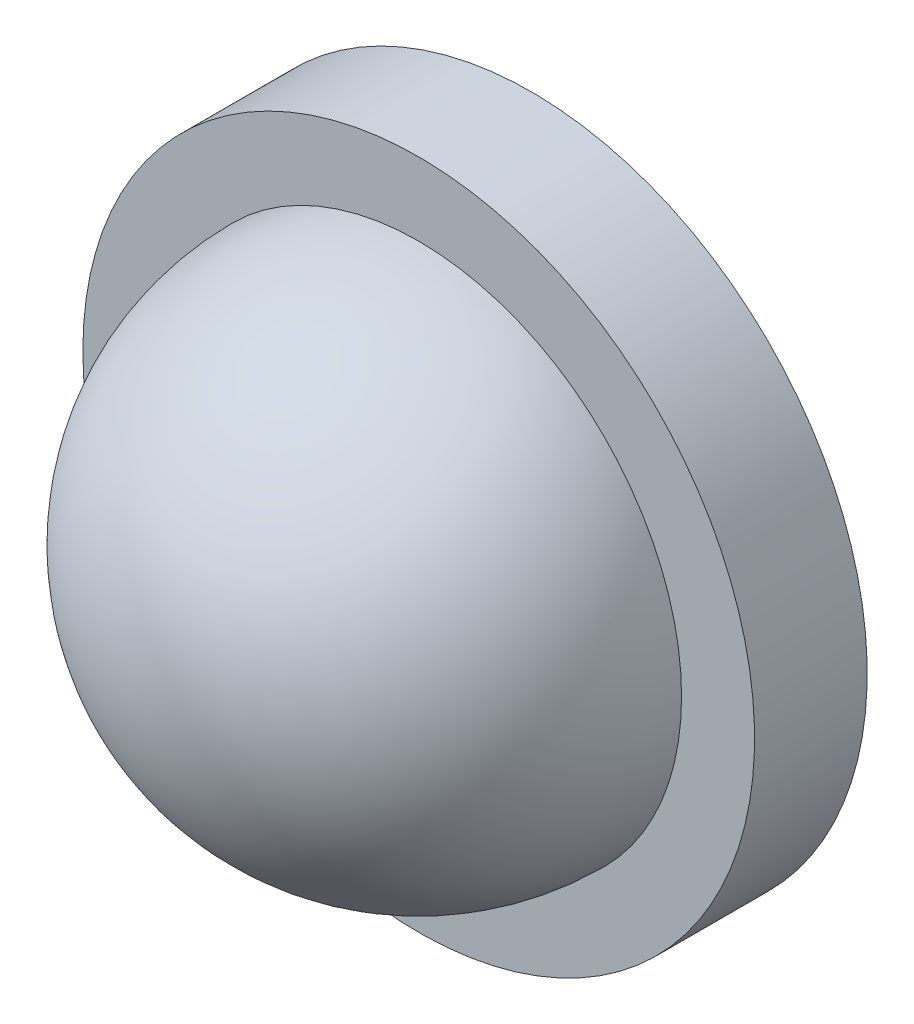
ISO-10303-21;
HEADER;
FILE_DESCRIPTION(('STEP AP214'),'2;1');
FILE_NAME('part.step','',(''),(''),'','','');
FILE_SCHEMA(('AUTOMOTIVE_DESIGN { 1 0 10303 214 1 1 1 1 }'));
ENDSEC;
DATA;
#1=APPLICATION_CONTEXT('core data for automotive mechanical design processes');
#2=APPLICATION_PROTOCOL_DEFINITION('international standard','automotive_design',2000,#1);
#3=PRODUCT_CONTEXT('',#1,'mechanical');
#4=PRODUCT('Part','Part','',(#3));
#5=PRODUCT_RELATED_PRODUCT_CATEGORY('part','',(#4));
#6=PRODUCT_DEFINITION_FORMATION('','',#4);
#7=PRODUCT_DEFINITION_CONTEXT('part definition',#1,'design');
#8=PRODUCT_DEFINITION('design','',#6,#7);
#9=PRODUCT_DEFINITION_SHAPE('','',#8);
#10=(LENGTH_UNIT() NAMED_UNIT(*) SI_UNIT(.MILLI.,.METRE.));
#11=(NAMED_UNIT(*) PLANE_ANGLE_UNIT() SI_UNIT($,.RADIAN.));
#12=(NAMED_UNIT(*) SI_UNIT($,.STERADIAN.) SOLID_ANGLE_UNIT());
#13=UNCERTAINTY_MEASURE_WITH_UNIT(LENGTH_MEASURE(1.E-05),#10,'distance_accuracy_value','');
#14=(GEOMETRIC_REPRESENTATION_CONTEXT(3) GLOBAL_UNCERTAINTY_ASSIGNED_CONTEXT((#13)) GLOBAL_UNIT_ASSIGNED_CONTEXT((#10,
#11,#12)) REPRESENTATION_CONTEXT('',''));
#15=CARTESIAN_POINT('',(0.,0.,0.));
#16=DIRECTION('',(0.,0.,1.));
#17=DIRECTION('',(1.,0.,0.));
#18=AXIS2_PLACEMENT_3D('',#15,#16,#17);
#19=CARTESIAN_POINT('',(0.,0.,0.));
#20=DIRECTION('',(0.,0.,1.));
#21=DIRECTION('',(1.,0.,0.));
#22=AXIS2_PLACEMENT_3D('',#19,#20,#21);
#23=PLANE('',#22);
#24=CARTESIAN_POINT('',(0.,0.,0.));
#25=DIRECTION('',(0.,0.,1.));
#26=DIRECTION('',(1.,0.,0.));
#27=AXIS2_PLACEMENT_3D('',#24,#25,#26);
#28=CIRCLE('',#27,44.7213595499958);
#29=CARTESIAN_POINT('',(-44.7213595499958,0.,0.));
#30=VERTEX_POINT('',#29);
#31=EDGE_CURVE('E9',#30,#30,#28,.T.);
#32=ORIENTED_EDGE('',*,*,#31,.T.);
#33=EDGE_LOOP('',(#32));
#34=FACE_BOUND('',#33,.T.);
#35=CARTESIAN_POINT('',(0.,0.,0.));
#36=DIRECTION('',(0.,0.,1.));
#37=DIRECTION('',(0.,1.,0.));
#38=AXIS2_PLACEMENT_3D('',#35,#36,#37);
#39=CIRCLE('',#38,35.);
#40=CARTESIAN_POINT('',(-35.,0.,0.));
#41=VERTEX_POINT('',#40);
#42=EDGE_CURVE('E52',#41,#41,#39,.T.);
#43=ORIENTED_EDGE('',*,*,#42,.F.);
#44=EDGE_LOOP('',(#43));
#45=FACE_BOUND('',#44,.T.);
#46=ADVANCED_FACE('F14',(#34,#45),#23,.T.);
#47=CARTESIAN_POINT('',(0.,0.,0.));
#48=DIRECTION('',(0.,0.,-1.));
#49=DIRECTION('',(1.,0.,0.));
#50=AXIS2_PLACEMENT_3D('',#47,#48,#49);
#51=CYLINDRICAL_SURFACE('',#50,44.7213595499958);
#52=CARTESIAN_POINT('',(0.,0.,-15.));
#53=DIRECTION('',(0.,0.,-1.));
#54=DIRECTION('',(1.,0.,0.));
#55=AXIS2_PLACEMENT_3D('',#52,#53,#54);
#56=CIRCLE('',#55,44.7213595499958);
#57=CARTESIAN_POINT('',(-44.7213595499958,0.,-15.));
#58=VERTEX_POINT('',#57);
#59=EDGE_CURVE('E43',#58,#58,#56,.T.);
#60=ORIENTED_EDGE('',*,*,#59,.F.);
#61=DIRECTION('',(0.,0.,1.));
#62=VECTOR('',#61,1.);
#63=CARTESIAN_POINT('',(-44.7213595499958,0.,0.));
#64=LINE('',#63,#62);
#65=EDGE_CURVE('E24',#58,#30,#64,.T.);
#66=ORIENTED_EDGE('',*,*,#65,.T.);
#67=ORIENTED_EDGE('',*,*,#31,.F.);
#68=ORIENTED_EDGE('',*,*,#65,.F.);
#69=EDGE_LOOP('',(#60,#66,#67,#68));
#70=FACE_BOUND('',#69,.T.);
#71=ADVANCED_FACE('F16',(#70),#51,.T.);
#72=CARTESIAN_POINT('',(0.,0.,-15.));
#73=DIRECTION('',(0.,0.,1.));
#74=DIRECTION('',(1.,0.,0.));
#75=AXIS2_PLACEMENT_3D('',#72,#73,#74);
#76=PLANE('',#75);
#77=ORIENTED_EDGE('',*,*,#59,.T.);
#78=EDGE_LOOP('',(#77));
#79=FACE_BOUND('',#78,.T.);
#80=ADVANCED_FACE('F65',(#79),#76,.F.);
#81=CARTESIAN_POINT('',(0.,0.,0.));
#82=DIRECTION('',(0.,0.,1.));
#83=DIRECTION('',(1.,0.,0.));
#84=AXIS2_PLACEMENT_3D('',#81,#82,#83);
#85=SPHERICAL_SURFACE('',#84,35.);
#86=ORIENTED_EDGE('',*,*,#42,.T.);
#87=CARTESIAN_POINT('',(0.,0.,0.));
#88=DIRECTION('',(0.,-1.,0.));
#89=DIRECTION('',(-1.,0.,0.));
#90=AXIS2_PLACEMENT_3D('',#87,#88,#89);
#91=CIRCLE('',#90,35.);
#92=CARTESIAN_POINT('',(0.,0.,35.));
#93=VERTEX_POINT('',#92);
#94=EDGE_CURVE('E50',#93,#41,#91,.T.);
#95=ORIENTED_EDGE('',*,*,#94,.F.);
#96=ORIENTED_EDGE('',*,*,#94,.T.);
#97=EDGE_LOOP('',(#86,#95,#96));
#98=FACE_BOUND('',#97,.T.);
#99=ADVANCED_FACE('F51',(#98),#85,.T.);
#100=CLOSED_SHELL('',(#46,#71,#80,#99));
#101=MANIFOLD_SOLID_BREP('B1',#100);
#102=ADVANCED_BREP_SHAPE_REPRESENTATION('',(#18,#101),#14);
#103=SHAPE_DEFINITION_REPRESENTATION(#9,#102);
ENDSEC;
END-ISO-10303-21;
